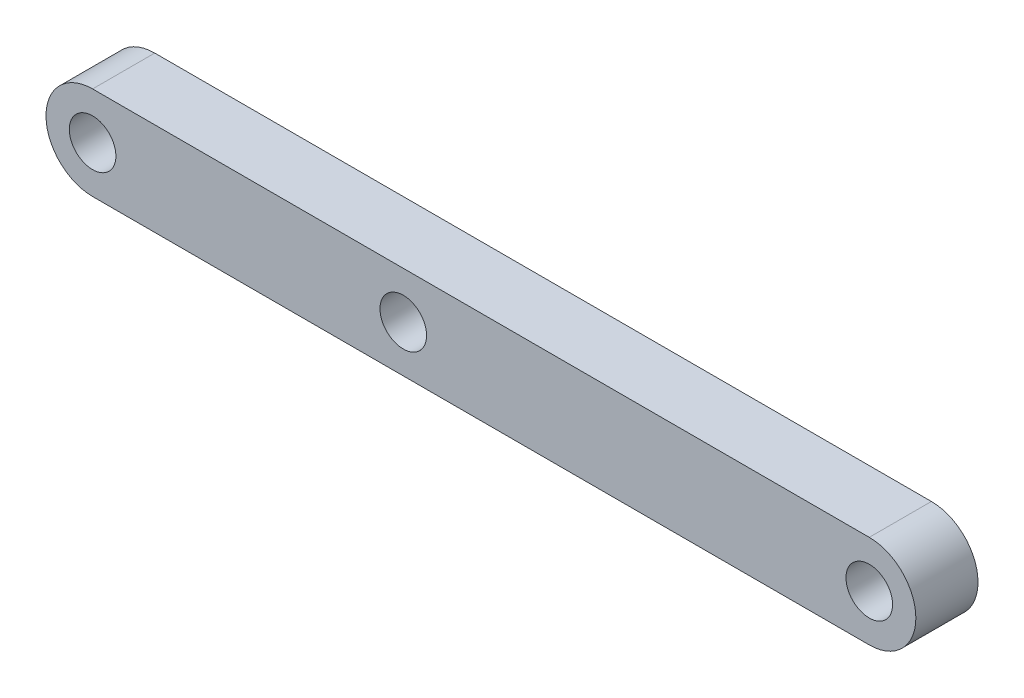
ISO-10303-21;
HEADER;
FILE_DESCRIPTION(('STEP AP214'),'2;1');
FILE_NAME('part.step','',(''),(''),'','','');
FILE_SCHEMA(('AUTOMOTIVE_DESIGN { 1 0 10303 214 1 1 1 1 }'));
ENDSEC;
DATA;
#1=APPLICATION_CONTEXT('core data for automotive mechanical design processes');
#2=APPLICATION_PROTOCOL_DEFINITION('international standard','automotive_design',2000,#1);
#3=PRODUCT_CONTEXT('',#1,'mechanical');
#4=PRODUCT('Part','Part','',(#3));
#5=PRODUCT_RELATED_PRODUCT_CATEGORY('part','',(#4));
#6=PRODUCT_DEFINITION_FORMATION('','',#4);
#7=PRODUCT_DEFINITION_CONTEXT('part definition',#1,'design');
#8=PRODUCT_DEFINITION('design','',#6,#7);
#9=PRODUCT_DEFINITION_SHAPE('','',#8);
#10=(LENGTH_UNIT() NAMED_UNIT(*) SI_UNIT(.MILLI.,.METRE.));
#11=(NAMED_UNIT(*) PLANE_ANGLE_UNIT() SI_UNIT($,.RADIAN.));
#12=(NAMED_UNIT(*) SI_UNIT($,.STERADIAN.) SOLID_ANGLE_UNIT());
#13=UNCERTAINTY_MEASURE_WITH_UNIT(LENGTH_MEASURE(1.E-05),#10,'distance_accuracy_value','');
#14=(GEOMETRIC_REPRESENTATION_CONTEXT(3) GLOBAL_UNCERTAINTY_ASSIGNED_CONTEXT((#13)) GLOBAL_UNIT_ASSIGNED_CONTEXT((#10,
#11,#12)) REPRESENTATION_CONTEXT('',''));
#15=CARTESIAN_POINT('',(0.,0.,0.));
#16=DIRECTION('',(0.,0.,1.));
#17=DIRECTION('',(1.,0.,0.));
#18=AXIS2_PLACEMENT_3D('',#15,#16,#17);
#19=CARTESIAN_POINT('',(-25.,0.,4.));
#20=DIRECTION('',(0.,0.,1.));
#21=DIRECTION('',(1.,0.,0.));
#22=AXIS2_PLACEMENT_3D('',#19,#20,#21);
#23=PLANE('',#22);
#24=CARTESIAN_POINT('',(25.,0.,4.));
#25=DIRECTION('',(0.,0.,1.));
#26=DIRECTION('',(1.,0.,0.));
#27=AXIS2_PLACEMENT_3D('',#24,#25,#26);
#28=CIRCLE('',#27,1.5);
#29=CARTESIAN_POINT('',(26.5,0.,4.));
#30=VERTEX_POINT('',#29);
#31=EDGE_CURVE('E115',#30,#30,#28,.T.);
#32=ORIENTED_EDGE('',*,*,#31,.F.);
#33=EDGE_LOOP('',(#32));
#34=FACE_BOUND('',#33,.T.);
#35=CARTESIAN_POINT('',(-25.,0.,4.));
#36=DIRECTION('',(0.,0.,1.));
#37=DIRECTION('',(1.,0.,0.));
#38=AXIS2_PLACEMENT_3D('',#35,#36,#37);
#39=CIRCLE('',#38,3.);
#40=CARTESIAN_POINT('',(-25.,3.,4.));
#41=VERTEX_POINT('',#40);
#42=CARTESIAN_POINT('',(-25.,-3.,4.));
#43=VERTEX_POINT('',#42);
#44=EDGE_CURVE('E85',#41,#43,#39,.T.);
#45=ORIENTED_EDGE('',*,*,#44,.T.);
#46=DIRECTION('',(1.,0.,0.));
#47=VECTOR('',#46,1.);
#48=CARTESIAN_POINT('',(-25.,-3.,4.));
#49=LINE('',#48,#47);
#50=CARTESIAN_POINT('',(25.,-2.99999999999999,4.));
#51=VERTEX_POINT('',#50);
#52=EDGE_CURVE('E80',#43,#51,#49,.T.);
#53=ORIENTED_EDGE('',*,*,#52,.T.);
#54=CARTESIAN_POINT('',(25.,0.,4.));
#55=DIRECTION('',(0.,0.,1.));
#56=DIRECTION('',(1.,0.,0.));
#57=AXIS2_PLACEMENT_3D('',#54,#55,#56);
#58=CIRCLE('',#57,3.);
#59=CARTESIAN_POINT('',(25.,3.00000000000001,4.));
#60=VERTEX_POINT('',#59);
#61=EDGE_CURVE('E83',#51,#60,#58,.T.);
#62=ORIENTED_EDGE('',*,*,#61,.T.);
#63=DIRECTION('',(-1.,0.,0.));
#64=VECTOR('',#63,1.);
#65=CARTESIAN_POINT('',(-25.,3.,4.));
#66=LINE('',#65,#64);
#67=EDGE_CURVE('E50',#60,#41,#66,.T.);
#68=ORIENTED_EDGE('',*,*,#67,.T.);
#69=EDGE_LOOP('',(#45,#53,#62,#68));
#70=FACE_BOUND('',#69,.T.);
#71=CARTESIAN_POINT('',(-25.,0.,4.));
#72=DIRECTION('',(0.,0.,1.));
#73=DIRECTION('',(1.,0.,0.));
#74=AXIS2_PLACEMENT_3D('',#71,#72,#73);
#75=CIRCLE('',#74,1.5);
#76=CARTESIAN_POINT('',(-23.5,0.,4.));
#77=VERTEX_POINT('',#76);
#78=EDGE_CURVE('E100',#77,#77,#75,.T.);
#79=ORIENTED_EDGE('',*,*,#78,.F.);
#80=EDGE_LOOP('',(#79));
#81=FACE_BOUND('',#80,.T.);
#82=CARTESIAN_POINT('',(-5.,0.,4.));
#83=DIRECTION('',(0.,0.,1.));
#84=DIRECTION('',(1.,0.,0.));
#85=AXIS2_PLACEMENT_3D('',#82,#83,#84);
#86=CIRCLE('',#85,1.5);
#87=CARTESIAN_POINT('',(-3.5,0.,4.));
#88=VERTEX_POINT('',#87);
#89=EDGE_CURVE('E121',#88,#88,#86,.T.);
#90=ORIENTED_EDGE('',*,*,#89,.F.);
#91=EDGE_LOOP('',(#90));
#92=FACE_BOUND('',#91,.T.);
#93=ADVANCED_FACE('F33',(#34,#70,#81,#92),#23,.T.);
#94=CARTESIAN_POINT('',(-25.,0.,0.));
#95=DIRECTION('',(0.,0.,1.));
#96=DIRECTION('',(1.,0.,0.));
#97=AXIS2_PLACEMENT_3D('',#94,#95,#96);
#98=PLANE('',#97);
#99=CARTESIAN_POINT('',(-25.,0.,0.));
#100=DIRECTION('',(0.,0.,1.));
#101=DIRECTION('',(1.,0.,0.));
#102=AXIS2_PLACEMENT_3D('',#99,#100,#101);
#103=CIRCLE('',#102,3.);
#104=CARTESIAN_POINT('',(-25.,3.,0.));
#105=VERTEX_POINT('',#104);
#106=CARTESIAN_POINT('',(-25.,-3.,0.));
#107=VERTEX_POINT('',#106);
#108=EDGE_CURVE('E97',#105,#107,#103,.T.);
#109=ORIENTED_EDGE('',*,*,#108,.F.);
#110=DIRECTION('',(-1.,0.,0.));
#111=VECTOR('',#110,1.);
#112=CARTESIAN_POINT('',(-25.,3.,0.));
#113=LINE('',#112,#111);
#114=CARTESIAN_POINT('',(25.,3.00000000000001,0.));
#115=VERTEX_POINT('',#114);
#116=EDGE_CURVE('E73',#115,#105,#113,.T.);
#117=ORIENTED_EDGE('',*,*,#116,.F.);
#118=CARTESIAN_POINT('',(25.,0.,0.));
#119=DIRECTION('',(0.,0.,1.));
#120=DIRECTION('',(1.,0.,0.));
#121=AXIS2_PLACEMENT_3D('',#118,#119,#120);
#122=CIRCLE('',#121,3.);
#123=CARTESIAN_POINT('',(25.,-2.99999999999999,0.));
#124=VERTEX_POINT('',#123);
#125=EDGE_CURVE('E67',#124,#115,#122,.T.);
#126=ORIENTED_EDGE('',*,*,#125,.F.);
#127=DIRECTION('',(1.,0.,0.));
#128=VECTOR('',#127,1.);
#129=CARTESIAN_POINT('',(-25.,-3.,0.));
#130=LINE('',#129,#128);
#131=EDGE_CURVE('E89',#107,#124,#130,.T.);
#132=ORIENTED_EDGE('',*,*,#131,.F.);
#133=EDGE_LOOP('',(#109,#117,#126,#132));
#134=FACE_BOUND('',#133,.T.);
#135=CARTESIAN_POINT('',(-25.,0.,0.));
#136=DIRECTION('',(0.,0.,1.));
#137=DIRECTION('',(1.,0.,0.));
#138=AXIS2_PLACEMENT_3D('',#135,#136,#137);
#139=CIRCLE('',#138,1.5);
#140=CARTESIAN_POINT('',(-23.5,0.,0.));
#141=VERTEX_POINT('',#140);
#142=EDGE_CURVE('E112',#141,#141,#139,.T.);
#143=ORIENTED_EDGE('',*,*,#142,.T.);
#144=EDGE_LOOP('',(#143));
#145=FACE_BOUND('',#144,.T.);
#146=CARTESIAN_POINT('',(25.,0.,0.));
#147=DIRECTION('',(0.,0.,1.));
#148=DIRECTION('',(1.,0.,0.));
#149=AXIS2_PLACEMENT_3D('',#146,#147,#148);
#150=CIRCLE('',#149,1.5);
#151=CARTESIAN_POINT('',(26.5,0.,0.));
#152=VERTEX_POINT('',#151);
#153=EDGE_CURVE('E118',#152,#152,#150,.T.);
#154=ORIENTED_EDGE('',*,*,#153,.T.);
#155=EDGE_LOOP('',(#154));
#156=FACE_BOUND('',#155,.T.);
#157=CARTESIAN_POINT('',(-5.,0.,0.));
#158=DIRECTION('',(0.,0.,1.));
#159=DIRECTION('',(1.,0.,0.));
#160=AXIS2_PLACEMENT_3D('',#157,#158,#159);
#161=CIRCLE('',#160,1.5);
#162=CARTESIAN_POINT('',(-3.5,0.,0.));
#163=VERTEX_POINT('',#162);
#164=EDGE_CURVE('E124',#163,#163,#161,.T.);
#165=ORIENTED_EDGE('',*,*,#164,.T.);
#166=EDGE_LOOP('',(#165));
#167=FACE_BOUND('',#166,.T.);
#168=ADVANCED_FACE('F108',(#134,#145,#156,#167),#98,.F.);
#169=CARTESIAN_POINT('',(-25.,0.,4.));
#170=DIRECTION('',(0.,0.,-1.));
#171=DIRECTION('',(-1.,0.,0.));
#172=AXIS2_PLACEMENT_3D('',#169,#170,#171);
#173=CYLINDRICAL_SURFACE('',#172,3.);
#174=ORIENTED_EDGE('',*,*,#108,.T.);
#175=DIRECTION('',(0.,0.,-1.));
#176=VECTOR('',#175,1.);
#177=CARTESIAN_POINT('',(-25.,-3.,4.));
#178=LINE('',#177,#176);
#179=EDGE_CURVE('E11',#43,#107,#178,.T.);
#180=ORIENTED_EDGE('',*,*,#179,.F.);
#181=ORIENTED_EDGE('',*,*,#44,.F.);
#182=DIRECTION('',(0.,0.,-1.));
#183=VECTOR('',#182,1.);
#184=CARTESIAN_POINT('',(-25.,3.,4.));
#185=LINE('',#184,#183);
#186=EDGE_CURVE('E93',#41,#105,#185,.T.);
#187=ORIENTED_EDGE('',*,*,#186,.T.);
#188=EDGE_LOOP('',(#174,#180,#181,#187));
#189=FACE_BOUND('',#188,.T.);
#190=ADVANCED_FACE('F35',(#189),#173,.T.);
#191=CARTESIAN_POINT('',(-25.,-3.,4.));
#192=DIRECTION('',(0.,1.,0.));
#193=DIRECTION('',(-1.,0.,0.));
#194=AXIS2_PLACEMENT_3D('',#191,#192,#193);
#195=PLANE('',#194);
#196=ORIENTED_EDGE('',*,*,#131,.T.);
#197=DIRECTION('',(0.,0.,-1.));
#198=VECTOR('',#197,1.);
#199=CARTESIAN_POINT('',(25.,-2.99999999999999,4.));
#200=LINE('',#199,#198);
#201=EDGE_CURVE('E42',#51,#124,#200,.T.);
#202=ORIENTED_EDGE('',*,*,#201,.F.);
#203=ORIENTED_EDGE('',*,*,#52,.F.);
#204=ORIENTED_EDGE('',*,*,#179,.T.);
#205=EDGE_LOOP('',(#196,#202,#203,#204));
#206=FACE_BOUND('',#205,.T.);
#207=ADVANCED_FACE('F88',(#206),#195,.F.);
#208=CARTESIAN_POINT('',(25.,0.,4.));
#209=DIRECTION('',(0.,0.,-1.));
#210=DIRECTION('',(-1.,0.,0.));
#211=AXIS2_PLACEMENT_3D('',#208,#209,#210);
#212=CYLINDRICAL_SURFACE('',#211,3.);
#213=ORIENTED_EDGE('',*,*,#125,.T.);
#214=DIRECTION('',(0.,0.,-1.));
#215=VECTOR('',#214,1.);
#216=CARTESIAN_POINT('',(25.,3.00000000000001,4.));
#217=LINE('',#216,#215);
#218=EDGE_CURVE('E90',#60,#115,#217,.T.);
#219=ORIENTED_EDGE('',*,*,#218,.F.);
#220=ORIENTED_EDGE('',*,*,#61,.F.);
#221=ORIENTED_EDGE('',*,*,#201,.T.);
#222=EDGE_LOOP('',(#213,#219,#220,#221));
#223=FACE_BOUND('',#222,.T.);
#224=ADVANCED_FACE('F91',(#223),#212,.T.);
#225=CARTESIAN_POINT('',(-25.,3.,4.));
#226=DIRECTION('',(0.,-1.,0.));
#227=DIRECTION('',(1.,0.,0.));
#228=AXIS2_PLACEMENT_3D('',#225,#226,#227);
#229=PLANE('',#228);
#230=ORIENTED_EDGE('',*,*,#116,.T.);
#231=ORIENTED_EDGE('',*,*,#186,.F.);
#232=ORIENTED_EDGE('',*,*,#67,.F.);
#233=ORIENTED_EDGE('',*,*,#218,.T.);
#234=EDGE_LOOP('',(#230,#231,#232,#233));
#235=FACE_BOUND('',#234,.T.);
#236=ADVANCED_FACE('F105',(#235),#229,.F.);
#237=CARTESIAN_POINT('',(-25.,0.,4.));
#238=DIRECTION('',(0.,0.,-1.));
#239=DIRECTION('',(-1.,0.,0.));
#240=AXIS2_PLACEMENT_3D('',#237,#238,#239);
#241=CYLINDRICAL_SURFACE('',#240,1.5);
#242=ORIENTED_EDGE('',*,*,#78,.T.);
#243=EDGE_LOOP('',(#242));
#244=FACE_BOUND('',#243,.T.);
#245=ORIENTED_EDGE('',*,*,#142,.F.);
#246=EDGE_LOOP('',(#245));
#247=FACE_BOUND('',#246,.T.);
#248=ADVANCED_FACE('F142',(#244,#247),#241,.F.);
#249=CARTESIAN_POINT('',(25.,0.,4.));
#250=DIRECTION('',(0.,0.,-1.));
#251=DIRECTION('',(-1.,0.,0.));
#252=AXIS2_PLACEMENT_3D('',#249,#250,#251);
#253=CYLINDRICAL_SURFACE('',#252,1.5);
#254=ORIENTED_EDGE('',*,*,#31,.T.);
#255=EDGE_LOOP('',(#254));
#256=FACE_BOUND('',#255,.T.);
#257=ORIENTED_EDGE('',*,*,#153,.F.);
#258=EDGE_LOOP('',(#257));
#259=FACE_BOUND('',#258,.T.);
#260=ADVANCED_FACE('F188',(#256,#259),#253,.F.);
#261=CARTESIAN_POINT('',(-5.,0.,4.));
#262=DIRECTION('',(0.,0.,-1.));
#263=DIRECTION('',(-1.,0.,0.));
#264=AXIS2_PLACEMENT_3D('',#261,#262,#263);
#265=CYLINDRICAL_SURFACE('',#264,1.5);
#266=ORIENTED_EDGE('',*,*,#89,.T.);
#267=EDGE_LOOP('',(#266));
#268=FACE_BOUND('',#267,.T.);
#269=ORIENTED_EDGE('',*,*,#164,.F.);
#270=EDGE_LOOP('',(#269));
#271=FACE_BOUND('',#270,.T.);
#272=ADVANCED_FACE('F130',(#268,#271),#265,.F.);
#273=CLOSED_SHELL('',(#93,#168,#190,#207,#224,#236,#248,#260,#272));
#274=MANIFOLD_SOLID_BREP('B2',#273);
#275=ADVANCED_BREP_SHAPE_REPRESENTATION('',(#18,#274),#14);
#276=SHAPE_DEFINITION_REPRESENTATION(#9,#275);
ENDSEC;
END-ISO-10303-21;
